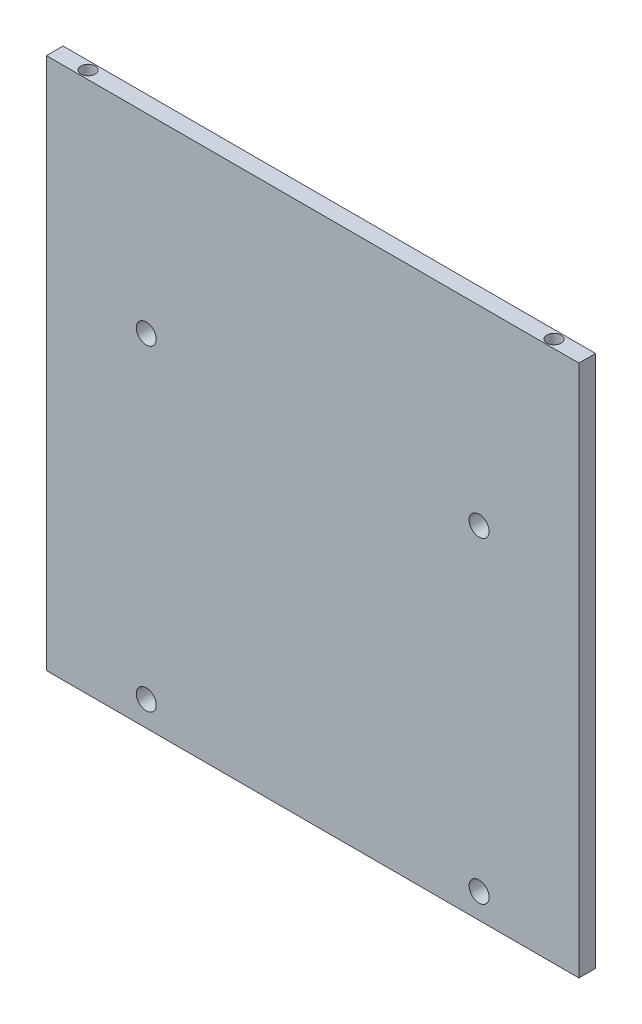
ISO-10303-21;
HEADER;
FILE_DESCRIPTION(('STEP AP214'),'2;1');
FILE_NAME('part.step','',(''),(''),'','','');
FILE_SCHEMA(('AUTOMOTIVE_DESIGN { 1 0 10303 214 1 1 1 1 }'));
ENDSEC;
DATA;
#1=APPLICATION_CONTEXT('core data for automotive mechanical design processes');
#2=APPLICATION_PROTOCOL_DEFINITION('international standard','automotive_design',2000,#1);
#3=PRODUCT_CONTEXT('',#1,'mechanical');
#4=PRODUCT('Part','Part','',(#3));
#5=PRODUCT_RELATED_PRODUCT_CATEGORY('part','',(#4));
#6=PRODUCT_DEFINITION_FORMATION('','',#4);
#7=PRODUCT_DEFINITION_CONTEXT('part definition',#1,'design');
#8=PRODUCT_DEFINITION('design','',#6,#7);
#9=PRODUCT_DEFINITION_SHAPE('','',#8);
#10=(LENGTH_UNIT() NAMED_UNIT(*) SI_UNIT(.MILLI.,.METRE.));
#11=(NAMED_UNIT(*) PLANE_ANGLE_UNIT() SI_UNIT($,.RADIAN.));
#12=(NAMED_UNIT(*) SI_UNIT($,.STERADIAN.) SOLID_ANGLE_UNIT());
#13=UNCERTAINTY_MEASURE_WITH_UNIT(LENGTH_MEASURE(1.E-05),#10,'distance_accuracy_value','');
#14=(GEOMETRIC_REPRESENTATION_CONTEXT(3) GLOBAL_UNCERTAINTY_ASSIGNED_CONTEXT((#13)) GLOBAL_UNIT_ASSIGNED_CONTEXT((#10,
#11,#12)) REPRESENTATION_CONTEXT('',''));
#15=CARTESIAN_POINT('',(0.,0.,0.));
#16=DIRECTION('',(0.,0.,1.));
#17=DIRECTION('',(1.,0.,0.));
#18=AXIS2_PLACEMENT_3D('',#15,#16,#17);
#19=CARTESIAN_POINT('',(0.,0.,3.175));
#20=DIRECTION('',(1.,0.,0.));
#21=DIRECTION('',(0.,0.,-1.));
#22=AXIS2_PLACEMENT_3D('',#19,#20,#21);
#23=PLANE('',#22);
#24=DIRECTION('',(0.,-1.,0.));
#25=VECTOR('',#24,1.);
#26=CARTESIAN_POINT('',(0.,0.,0.));
#27=LINE('',#26,#25);
#28=CARTESIAN_POINT('',(0.,101.6,0.));
#29=VERTEX_POINT('',#28);
#30=CARTESIAN_POINT('',(0.,0.,0.));
#31=VERTEX_POINT('',#30);
#32=EDGE_CURVE('E132',#29,#31,#27,.T.);
#33=ORIENTED_EDGE('',*,*,#32,.T.);
#34=DIRECTION('',(0.,0.,-1.));
#35=VECTOR('',#34,1.);
#36=CARTESIAN_POINT('',(0.,0.,3.175));
#37=LINE('',#36,#35);
#38=CARTESIAN_POINT('',(0.,0.,3.175));
#39=VERTEX_POINT('',#38);
#40=EDGE_CURVE('E11',#39,#31,#37,.T.);
#41=ORIENTED_EDGE('',*,*,#40,.F.);
#42=DIRECTION('',(0.,-1.,0.));
#43=VECTOR('',#42,1.);
#44=CARTESIAN_POINT('',(0.,0.,3.175));
#45=LINE('',#44,#43);
#46=CARTESIAN_POINT('',(0.,101.6,3.175));
#47=VERTEX_POINT('',#46);
#48=EDGE_CURVE('E133',#47,#39,#45,.T.);
#49=ORIENTED_EDGE('',*,*,#48,.F.);
#50=DIRECTION('',(0.,0.,-1.));
#51=VECTOR('',#50,1.);
#52=CARTESIAN_POINT('',(0.,101.6,3.175));
#53=LINE('',#52,#51);
#54=EDGE_CURVE('E139',#47,#29,#53,.T.);
#55=ORIENTED_EDGE('',*,*,#54,.T.);
#56=EDGE_LOOP('',(#33,#41,#49,#55));
#57=FACE_BOUND('',#56,.T.);
#58=ADVANCED_FACE('F37',(#57),#23,.F.);
#59=CARTESIAN_POINT('',(0.,0.,3.175));
#60=DIRECTION('',(0.,1.,0.));
#61=DIRECTION('',(0.,0.,1.));
#62=AXIS2_PLACEMENT_3D('',#59,#60,#61);
#63=PLANE('',#62);
#64=CARTESIAN_POINT('',(95.25,0.,1.5875));
#65=DIRECTION('',(0.,-1.,0.));
#66=DIRECTION('',(0.,0.,-1.));
#67=AXIS2_PLACEMENT_3D('',#64,#65,#66);
#68=CIRCLE('',#67,1.35254999999999);
#69=CARTESIAN_POINT('',(95.25,0.,0.234950000000006));
#70=VERTEX_POINT('',#69);
#71=EDGE_CURVE('E108',#70,#70,#68,.T.);
#72=ORIENTED_EDGE('',*,*,#71,.F.);
#73=EDGE_LOOP('',(#72));
#74=FACE_BOUND('',#73,.T.);
#75=CARTESIAN_POINT('',(6.35,0.,1.5875));
#76=DIRECTION('',(0.,-1.,0.));
#77=DIRECTION('',(0.,0.,-1.));
#78=AXIS2_PLACEMENT_3D('',#75,#76,#77);
#79=CIRCLE('',#78,1.35254999999999);
#80=CARTESIAN_POINT('',(6.35,0.,0.234950000000011));
#81=VERTEX_POINT('',#80);
#82=EDGE_CURVE('E107',#81,#81,#79,.T.);
#83=ORIENTED_EDGE('',*,*,#82,.F.);
#84=EDGE_LOOP('',(#83));
#85=FACE_BOUND('',#84,.T.);
#86=DIRECTION('',(1.,0.,0.));
#87=VECTOR('',#86,1.);
#88=CARTESIAN_POINT('',(0.,0.,0.));
#89=LINE('',#88,#87);
#90=CARTESIAN_POINT('',(101.6,0.,0.));
#91=VERTEX_POINT('',#90);
#92=EDGE_CURVE('E142',#31,#91,#89,.T.);
#93=ORIENTED_EDGE('',*,*,#92,.T.);
#94=DIRECTION('',(0.,0.,-1.));
#95=VECTOR('',#94,1.);
#96=CARTESIAN_POINT('',(101.6,0.,3.175));
#97=LINE('',#96,#95);
#98=CARTESIAN_POINT('',(101.6,0.,3.175));
#99=VERTEX_POINT('',#98);
#100=EDGE_CURVE('E45',#99,#91,#97,.T.);
#101=ORIENTED_EDGE('',*,*,#100,.F.);
#102=DIRECTION('',(1.,0.,0.));
#103=VECTOR('',#102,1.);
#104=CARTESIAN_POINT('',(0.,0.,3.175));
#105=LINE('',#104,#103);
#106=EDGE_CURVE('E84',#39,#99,#105,.T.);
#107=ORIENTED_EDGE('',*,*,#106,.F.);
#108=ORIENTED_EDGE('',*,*,#40,.T.);
#109=EDGE_LOOP('',(#93,#101,#107,#108));
#110=FACE_BOUND('',#109,.T.);
#111=ADVANCED_FACE('F167',(#74,#85,#110),#63,.F.);
#112=CARTESIAN_POINT('',(101.6,0.,3.175));
#113=DIRECTION('',(-1.,0.,0.));
#114=DIRECTION('',(0.,0.,1.));
#115=AXIS2_PLACEMENT_3D('',#112,#113,#114);
#116=PLANE('',#115);
#117=DIRECTION('',(0.,1.,0.));
#118=VECTOR('',#117,1.);
#119=CARTESIAN_POINT('',(101.6,0.,0.));
#120=LINE('',#119,#118);
#121=CARTESIAN_POINT('',(101.6,101.6,0.));
#122=VERTEX_POINT('',#121);
#123=EDGE_CURVE('E71',#91,#122,#120,.T.);
#124=ORIENTED_EDGE('',*,*,#123,.T.);
#125=DIRECTION('',(0.,0.,-1.));
#126=VECTOR('',#125,1.);
#127=CARTESIAN_POINT('',(101.6,101.6,3.175));
#128=LINE('',#127,#126);
#129=CARTESIAN_POINT('',(101.6,101.6,3.175));
#130=VERTEX_POINT('',#129);
#131=EDGE_CURVE('E147',#130,#122,#128,.T.);
#132=ORIENTED_EDGE('',*,*,#131,.F.);
#133=DIRECTION('',(0.,1.,0.));
#134=VECTOR('',#133,1.);
#135=CARTESIAN_POINT('',(101.6,0.,3.175));
#136=LINE('',#135,#134);
#137=EDGE_CURVE('E136',#99,#130,#136,.T.);
#138=ORIENTED_EDGE('',*,*,#137,.F.);
#139=ORIENTED_EDGE('',*,*,#100,.T.);
#140=EDGE_LOOP('',(#124,#132,#138,#139));
#141=FACE_BOUND('',#140,.T.);
#142=ADVANCED_FACE('F149',(#141),#116,.F.);
#143=CARTESIAN_POINT('',(0.,101.6,3.175));
#144=DIRECTION('',(0.,-1.,0.));
#145=DIRECTION('',(0.,0.,-1.));
#146=AXIS2_PLACEMENT_3D('',#143,#144,#145);
#147=PLANE('',#146);
#148=CARTESIAN_POINT('',(95.25,101.6,1.5875));
#149=DIRECTION('',(0.,1.,0.));
#150=DIRECTION('',(0.,0.,1.));
#151=AXIS2_PLACEMENT_3D('',#148,#149,#150);
#152=CIRCLE('',#151,1.35254999999999);
#153=CARTESIAN_POINT('',(95.25,101.6,2.94004999999999));
#154=VERTEX_POINT('',#153);
#155=EDGE_CURVE('E120',#154,#154,#152,.T.);
#156=ORIENTED_EDGE('',*,*,#155,.F.);
#157=EDGE_LOOP('',(#156));
#158=FACE_BOUND('',#157,.T.);
#159=CARTESIAN_POINT('',(6.35,101.6,1.5875));
#160=DIRECTION('',(0.,1.,0.));
#161=DIRECTION('',(0.,0.,1.));
#162=AXIS2_PLACEMENT_3D('',#159,#160,#161);
#163=CIRCLE('',#162,1.35254999999999);
#164=CARTESIAN_POINT('',(6.35,101.6,2.94004999999999));
#165=VERTEX_POINT('',#164);
#166=EDGE_CURVE('E126',#165,#165,#163,.T.);
#167=ORIENTED_EDGE('',*,*,#166,.F.);
#168=EDGE_LOOP('',(#167));
#169=FACE_BOUND('',#168,.T.);
#170=DIRECTION('',(-1.,0.,0.));
#171=VECTOR('',#170,1.);
#172=CARTESIAN_POINT('',(0.,101.6,0.));
#173=LINE('',#172,#171);
#174=EDGE_CURVE('E77',#122,#29,#173,.T.);
#175=ORIENTED_EDGE('',*,*,#174,.T.);
#176=ORIENTED_EDGE('',*,*,#54,.F.);
#177=DIRECTION('',(-1.,0.,0.));
#178=VECTOR('',#177,1.);
#179=CARTESIAN_POINT('',(0.,101.6,3.175));
#180=LINE('',#179,#178);
#181=EDGE_CURVE('E53',#130,#47,#180,.T.);
#182=ORIENTED_EDGE('',*,*,#181,.F.);
#183=ORIENTED_EDGE('',*,*,#131,.T.);
#184=EDGE_LOOP('',(#175,#176,#182,#183));
#185=FACE_BOUND('',#184,.T.);
#186=ADVANCED_FACE('F156',(#158,#169,#185),#147,.F.);
#187=CARTESIAN_POINT('',(0.,0.,3.175));
#188=DIRECTION('',(0.,0.,-1.));
#189=DIRECTION('',(-1.,0.,0.));
#190=AXIS2_PLACEMENT_3D('',#187,#188,#189);
#191=PLANE('',#190);
#192=CARTESIAN_POINT('',(82.55,4.76250000000001,3.175));
#193=DIRECTION('',(0.,0.,-1.));
#194=DIRECTION('',(-1.,0.,0.));
#195=AXIS2_PLACEMENT_3D('',#192,#193,#194);
#196=CIRCLE('',#195,1.90500000000001);
#197=CARTESIAN_POINT('',(80.645,4.76250000000001,3.175));
#198=VERTEX_POINT('',#197);
#199=EDGE_CURVE('E239',#198,#198,#196,.T.);
#200=ORIENTED_EDGE('',*,*,#199,.T.);
#201=EDGE_LOOP('',(#200));
#202=FACE_BOUND('',#201,.T.);
#203=CARTESIAN_POINT('',(19.05,65.2145,3.175));
#204=DIRECTION('',(0.,0.,-1.));
#205=DIRECTION('',(-1.,0.,0.));
#206=AXIS2_PLACEMENT_3D('',#203,#204,#205);
#207=CIRCLE('',#206,1.905);
#208=CARTESIAN_POINT('',(17.145,65.2145,3.175));
#209=VERTEX_POINT('',#208);
#210=EDGE_CURVE('E234',#209,#209,#207,.T.);
#211=ORIENTED_EDGE('',*,*,#210,.T.);
#212=EDGE_LOOP('',(#211));
#213=FACE_BOUND('',#212,.T.);
#214=CARTESIAN_POINT('',(82.55,65.2145,3.175));
#215=DIRECTION('',(0.,0.,-1.));
#216=DIRECTION('',(-1.,0.,0.));
#217=AXIS2_PLACEMENT_3D('',#214,#215,#216);
#218=CIRCLE('',#217,1.90499999999999);
#219=CARTESIAN_POINT('',(80.645,65.2145,3.175));
#220=VERTEX_POINT('',#219);
#221=EDGE_CURVE('E235',#220,#220,#218,.T.);
#222=ORIENTED_EDGE('',*,*,#221,.T.);
#223=EDGE_LOOP('',(#222));
#224=FACE_BOUND('',#223,.T.);
#225=CARTESIAN_POINT('',(19.05,4.7625,3.175));
#226=DIRECTION('',(0.,0.,-1.));
#227=DIRECTION('',(-1.,0.,0.));
#228=AXIS2_PLACEMENT_3D('',#225,#226,#227);
#229=CIRCLE('',#228,1.905);
#230=CARTESIAN_POINT('',(17.145,4.7625,3.175));
#231=VERTEX_POINT('',#230);
#232=EDGE_CURVE('E229',#231,#231,#229,.T.);
#233=ORIENTED_EDGE('',*,*,#232,.T.);
#234=EDGE_LOOP('',(#233));
#235=FACE_BOUND('',#234,.T.);
#236=ORIENTED_EDGE('',*,*,#48,.T.);
#237=ORIENTED_EDGE('',*,*,#106,.T.);
#238=ORIENTED_EDGE('',*,*,#137,.T.);
#239=ORIENTED_EDGE('',*,*,#181,.T.);
#240=EDGE_LOOP('',(#236,#237,#238,#239));
#241=FACE_BOUND('',#240,.T.);
#242=ADVANCED_FACE('F158',(#202,#213,#224,#235,#241),#191,.F.);
#243=CARTESIAN_POINT('',(0.,0.,0.));
#244=DIRECTION('',(0.,0.,-1.));
#245=DIRECTION('',(-1.,0.,0.));
#246=AXIS2_PLACEMENT_3D('',#243,#244,#245);
#247=PLANE('',#246);
#248=CARTESIAN_POINT('',(82.55,4.76250000000001,0.));
#249=DIRECTION('',(0.,0.,-1.));
#250=DIRECTION('',(-1.,0.,0.));
#251=AXIS2_PLACEMENT_3D('',#248,#249,#250);
#252=CIRCLE('',#251,1.90500000000001);
#253=CARTESIAN_POINT('',(80.645,4.76250000000001,0.));
#254=VERTEX_POINT('',#253);
#255=EDGE_CURVE('E217',#254,#254,#252,.T.);
#256=ORIENTED_EDGE('',*,*,#255,.F.);
#257=EDGE_LOOP('',(#256));
#258=FACE_BOUND('',#257,.T.);
#259=CARTESIAN_POINT('',(19.05,65.2145,0.));
#260=DIRECTION('',(0.,0.,-1.));
#261=DIRECTION('',(-1.,0.,0.));
#262=AXIS2_PLACEMENT_3D('',#259,#260,#261);
#263=CIRCLE('',#262,1.905);
#264=CARTESIAN_POINT('',(17.145,65.2145,0.));
#265=VERTEX_POINT('',#264);
#266=EDGE_CURVE('E221',#265,#265,#263,.T.);
#267=ORIENTED_EDGE('',*,*,#266,.F.);
#268=EDGE_LOOP('',(#267));
#269=FACE_BOUND('',#268,.T.);
#270=CARTESIAN_POINT('',(82.55,65.2145,0.));
#271=DIRECTION('',(0.,0.,-1.));
#272=DIRECTION('',(-1.,0.,0.));
#273=AXIS2_PLACEMENT_3D('',#270,#271,#272);
#274=CIRCLE('',#273,1.90499999999999);
#275=CARTESIAN_POINT('',(80.645,65.2145,0.));
#276=VERTEX_POINT('',#275);
#277=EDGE_CURVE('E225',#276,#276,#274,.T.);
#278=ORIENTED_EDGE('',*,*,#277,.F.);
#279=EDGE_LOOP('',(#278));
#280=FACE_BOUND('',#279,.T.);
#281=CARTESIAN_POINT('',(19.05,4.7625,0.));
#282=DIRECTION('',(0.,0.,-1.));
#283=DIRECTION('',(-1.,0.,0.));
#284=AXIS2_PLACEMENT_3D('',#281,#282,#283);
#285=CIRCLE('',#284,1.905);
#286=CARTESIAN_POINT('',(17.145,4.7625,0.));
#287=VERTEX_POINT('',#286);
#288=EDGE_CURVE('E114',#287,#287,#285,.T.);
#289=ORIENTED_EDGE('',*,*,#288,.F.);
#290=EDGE_LOOP('',(#289));
#291=FACE_BOUND('',#290,.T.);
#292=ORIENTED_EDGE('',*,*,#32,.F.);
#293=ORIENTED_EDGE('',*,*,#174,.F.);
#294=ORIENTED_EDGE('',*,*,#123,.F.);
#295=ORIENTED_EDGE('',*,*,#92,.F.);
#296=EDGE_LOOP('',(#292,#293,#294,#295));
#297=FACE_BOUND('',#296,.T.);
#298=ADVANCED_FACE('F152',(#258,#269,#280,#291,#297),#247,.T.);
#299=CARTESIAN_POINT('',(6.35,86.614,1.5875));
#300=DIRECTION('',(0.,1.,0.));
#301=DIRECTION('',(0.,0.,1.));
#302=AXIS2_PLACEMENT_3D('',#299,#300,#301);
#303=CONICAL_SURFACE('',#302,1.35255,1.02974425867665);
#304=CARTESIAN_POINT('',(6.35,85.8013059697343,1.5875));
#305=VERTEX_POINT('',#304);
#306=VERTEX_LOOP('',#305);
#307=FACE_BOUND('',#306,.T.);
#308=CARTESIAN_POINT('',(6.35,86.614,1.5875));
#309=DIRECTION('',(0.,1.,0.));
#310=DIRECTION('',(0.,0.,1.));
#311=AXIS2_PLACEMENT_3D('',#308,#309,#310);
#312=CIRCLE('',#311,1.35255);
#313=CARTESIAN_POINT('',(6.35,86.614,2.94005));
#314=VERTEX_POINT('',#313);
#315=EDGE_CURVE('E129',#314,#314,#312,.T.);
#316=ORIENTED_EDGE('',*,*,#315,.T.);
#317=EDGE_LOOP('',(#316));
#318=FACE_BOUND('',#317,.T.);
#319=ADVANCED_FACE('F206',(#307,#318),#303,.F.);
#320=CARTESIAN_POINT('',(6.35,101.6,1.5875));
#321=DIRECTION('',(0.,1.,0.));
#322=DIRECTION('',(0.,0.,1.));
#323=AXIS2_PLACEMENT_3D('',#320,#321,#322);
#324=CYLINDRICAL_SURFACE('',#323,1.35254999999999);
#325=ORIENTED_EDGE('',*,*,#315,.F.);
#326=EDGE_LOOP('',(#325));
#327=FACE_BOUND('',#326,.T.);
#328=ORIENTED_EDGE('',*,*,#166,.T.);
#329=EDGE_LOOP('',(#328));
#330=FACE_BOUND('',#329,.T.);
#331=ADVANCED_FACE('F202',(#327,#330),#324,.F.);
#332=CARTESIAN_POINT('',(95.25,86.614,1.5875));
#333=DIRECTION('',(0.,1.,0.));
#334=DIRECTION('',(0.,0.,1.));
#335=AXIS2_PLACEMENT_3D('',#332,#333,#334);
#336=CONICAL_SURFACE('',#335,1.35254999999999,1.02974425867665);
#337=CARTESIAN_POINT('',(95.25,85.8013059697343,1.5875));
#338=VERTEX_POINT('',#337);
#339=VERTEX_LOOP('',#338);
#340=FACE_BOUND('',#339,.T.);
#341=CARTESIAN_POINT('',(95.25,86.614,1.5875));
#342=DIRECTION('',(0.,1.,0.));
#343=DIRECTION('',(0.,0.,1.));
#344=AXIS2_PLACEMENT_3D('',#341,#342,#343);
#345=CIRCLE('',#344,1.35254999999999);
#346=CARTESIAN_POINT('',(95.25,86.614,2.94004999999999));
#347=VERTEX_POINT('',#346);
#348=EDGE_CURVE('E123',#347,#347,#345,.T.);
#349=ORIENTED_EDGE('',*,*,#348,.T.);
#350=EDGE_LOOP('',(#349));
#351=FACE_BOUND('',#350,.T.);
#352=ADVANCED_FACE('F198',(#340,#351),#336,.F.);
#353=CARTESIAN_POINT('',(95.25,101.6,1.5875));
#354=DIRECTION('',(0.,1.,0.));
#355=DIRECTION('',(0.,0.,1.));
#356=AXIS2_PLACEMENT_3D('',#353,#354,#355);
#357=CYLINDRICAL_SURFACE('',#356,1.35254999999999);
#358=ORIENTED_EDGE('',*,*,#348,.F.);
#359=EDGE_LOOP('',(#358));
#360=FACE_BOUND('',#359,.T.);
#361=ORIENTED_EDGE('',*,*,#155,.T.);
#362=EDGE_LOOP('',(#361));
#363=FACE_BOUND('',#362,.T.);
#364=ADVANCED_FACE('F190',(#360,#363),#357,.F.);
#365=CARTESIAN_POINT('',(6.35,14.986,1.5875));
#366=DIRECTION('',(0.,-1.,0.));
#367=DIRECTION('',(0.,0.,-1.));
#368=AXIS2_PLACEMENT_3D('',#365,#366,#367);
#369=CONICAL_SURFACE('',#368,1.35255,1.02974425867665);
#370=CARTESIAN_POINT('',(6.35,15.7986940302657,1.5875));
#371=VERTEX_POINT('',#370);
#372=VERTEX_LOOP('',#371);
#373=FACE_BOUND('',#372,.T.);
#374=CARTESIAN_POINT('',(6.35,14.986,1.5875));
#375=DIRECTION('',(0.,-1.,0.));
#376=DIRECTION('',(0.,0.,-1.));
#377=AXIS2_PLACEMENT_3D('',#374,#375,#376);
#378=CIRCLE('',#377,1.35255);
#379=CARTESIAN_POINT('',(6.35,14.986,0.234950000000004));
#380=VERTEX_POINT('',#379);
#381=EDGE_CURVE('E111',#380,#380,#378,.T.);
#382=ORIENTED_EDGE('',*,*,#381,.T.);
#383=EDGE_LOOP('',(#382));
#384=FACE_BOUND('',#383,.T.);
#385=ADVANCED_FACE('F184',(#373,#384),#369,.F.);
#386=CARTESIAN_POINT('',(6.35,0.,1.5875));
#387=DIRECTION('',(0.,-1.,0.));
#388=DIRECTION('',(0.,0.,-1.));
#389=AXIS2_PLACEMENT_3D('',#386,#387,#388);
#390=CYLINDRICAL_SURFACE('',#389,1.35254999999999);
#391=ORIENTED_EDGE('',*,*,#381,.F.);
#392=EDGE_LOOP('',(#391));
#393=FACE_BOUND('',#392,.T.);
#394=ORIENTED_EDGE('',*,*,#82,.T.);
#395=EDGE_LOOP('',(#394));
#396=FACE_BOUND('',#395,.T.);
#397=ADVANCED_FACE('F101',(#393,#396),#390,.F.);
#398=CARTESIAN_POINT('',(95.25,14.986,1.5875));
#399=DIRECTION('',(0.,-1.,0.));
#400=DIRECTION('',(0.,0.,-1.));
#401=AXIS2_PLACEMENT_3D('',#398,#399,#400);
#402=CONICAL_SURFACE('',#401,1.35254999999999,1.02974425867665);
#403=CARTESIAN_POINT('',(95.25,15.7986940302657,1.5875));
#404=VERTEX_POINT('',#403);
#405=VERTEX_LOOP('',#404);
#406=FACE_BOUND('',#405,.T.);
#407=CARTESIAN_POINT('',(95.25,14.986,1.5875));
#408=DIRECTION('',(0.,-1.,0.));
#409=DIRECTION('',(0.,0.,-1.));
#410=AXIS2_PLACEMENT_3D('',#407,#408,#409);
#411=CIRCLE('',#410,1.35254999999999);
#412=CARTESIAN_POINT('',(95.25,14.986,0.234950000000006));
#413=VERTEX_POINT('',#412);
#414=EDGE_CURVE('E105',#413,#413,#411,.T.);
#415=ORIENTED_EDGE('',*,*,#414,.T.);
#416=EDGE_LOOP('',(#415));
#417=FACE_BOUND('',#416,.T.);
#418=ADVANCED_FACE('F97',(#406,#417),#402,.F.);
#419=CARTESIAN_POINT('',(95.25,0.,1.5875));
#420=DIRECTION('',(0.,-1.,0.));
#421=DIRECTION('',(0.,0.,-1.));
#422=AXIS2_PLACEMENT_3D('',#419,#420,#421);
#423=CYLINDRICAL_SURFACE('',#422,1.35254999999999);
#424=ORIENTED_EDGE('',*,*,#414,.F.);
#425=EDGE_LOOP('',(#424));
#426=FACE_BOUND('',#425,.T.);
#427=ORIENTED_EDGE('',*,*,#71,.T.);
#428=EDGE_LOOP('',(#427));
#429=FACE_BOUND('',#428,.T.);
#430=ADVANCED_FACE('F100',(#426,#429),#423,.F.);
#431=CARTESIAN_POINT('',(19.05,4.7625,-0.00100000000000013));
#432=DIRECTION('',(0.,0.,1.));
#433=DIRECTION('',(1.,0.,0.));
#434=AXIS2_PLACEMENT_3D('',#431,#432,#433);
#435=CYLINDRICAL_SURFACE('',#434,1.905);
#436=ORIENTED_EDGE('',*,*,#288,.T.);
#437=EDGE_LOOP('',(#436));
#438=FACE_BOUND('',#437,.T.);
#439=ORIENTED_EDGE('',*,*,#232,.F.);
#440=EDGE_LOOP('',(#439));
#441=FACE_BOUND('',#440,.T.);
#442=ADVANCED_FACE('F261',(#438,#441),#435,.F.);
#443=CARTESIAN_POINT('',(82.55,65.2145,-0.00100000000000013));
#444=DIRECTION('',(0.,0.,1.));
#445=DIRECTION('',(1.,0.,0.));
#446=AXIS2_PLACEMENT_3D('',#443,#444,#445);
#447=CYLINDRICAL_SURFACE('',#446,1.90499999999999);
#448=ORIENTED_EDGE('',*,*,#277,.T.);
#449=EDGE_LOOP('',(#448));
#450=FACE_BOUND('',#449,.T.);
#451=ORIENTED_EDGE('',*,*,#221,.F.);
#452=EDGE_LOOP('',(#451));
#453=FACE_BOUND('',#452,.T.);
#454=ADVANCED_FACE('F255',(#450,#453),#447,.F.);
#455=CARTESIAN_POINT('',(19.05,65.2145,-0.00100000000000013));
#456=DIRECTION('',(0.,0.,1.));
#457=DIRECTION('',(1.,0.,0.));
#458=AXIS2_PLACEMENT_3D('',#455,#456,#457);
#459=CYLINDRICAL_SURFACE('',#458,1.905);
#460=ORIENTED_EDGE('',*,*,#266,.T.);
#461=EDGE_LOOP('',(#460));
#462=FACE_BOUND('',#461,.T.);
#463=ORIENTED_EDGE('',*,*,#210,.F.);
#464=EDGE_LOOP('',(#463));
#465=FACE_BOUND('',#464,.T.);
#466=ADVANCED_FACE('F249',(#462,#465),#459,.F.);
#467=CARTESIAN_POINT('',(82.55,4.76250000000001,-0.00100000000000013));
#468=DIRECTION('',(0.,0.,1.));
#469=DIRECTION('',(1.,0.,0.));
#470=AXIS2_PLACEMENT_3D('',#467,#468,#469);
#471=CYLINDRICAL_SURFACE('',#470,1.90500000000001);
#472=ORIENTED_EDGE('',*,*,#255,.T.);
#473=EDGE_LOOP('',(#472));
#474=FACE_BOUND('',#473,.T.);
#475=ORIENTED_EDGE('',*,*,#199,.F.);
#476=EDGE_LOOP('',(#475));
#477=FACE_BOUND('',#476,.T.);
#478=ADVANCED_FACE('F247',(#474,#477),#471,.F.);
#479=CLOSED_SHELL('',(#58,#111,#142,#186,#242,#298,#319,#331,#352,#364,#385,#397,#418,#430,#442,
#454,#466,#478));
#480=MANIFOLD_SOLID_BREP('B2',#479);
#481=ADVANCED_BREP_SHAPE_REPRESENTATION('',(#18,#480),#14);
#482=SHAPE_DEFINITION_REPRESENTATION(#9,#481);
ENDSEC;
END-ISO-10303-21;
